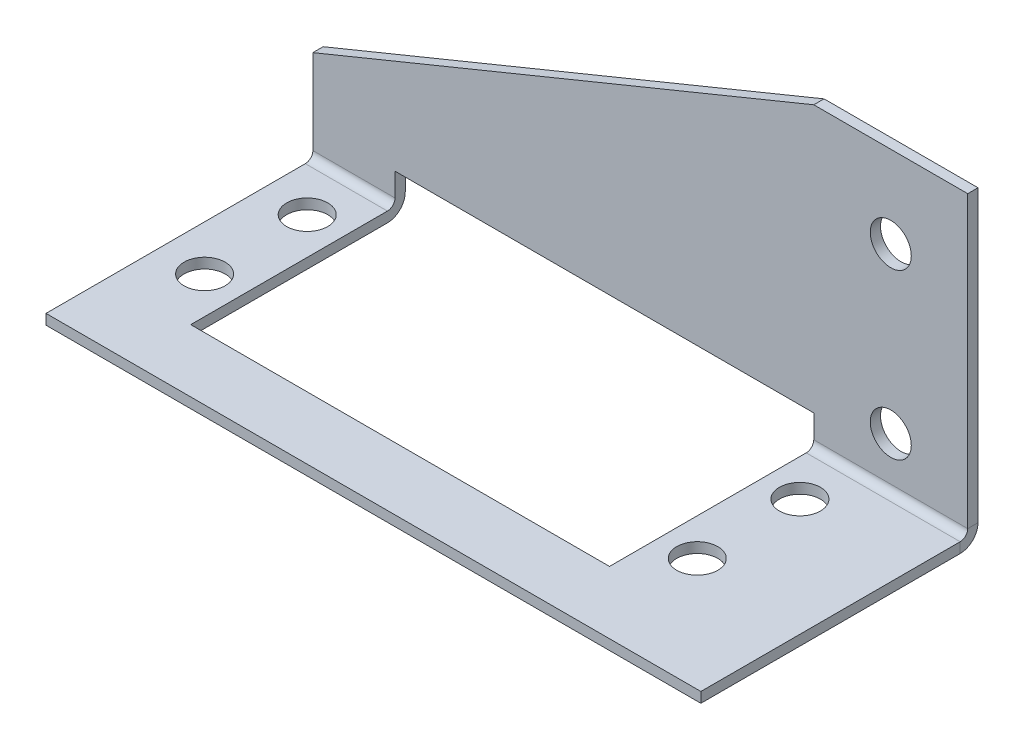
ISO-10303-21;
HEADER;
FILE_DESCRIPTION(('STEP AP214'),'2;1');
FILE_NAME('part.step','',(''),(''),'','','');
FILE_SCHEMA(('AUTOMOTIVE_DESIGN { 1 0 10303 214 1 1 1 1 }'));
ENDSEC;
DATA;
#1=APPLICATION_CONTEXT('core data for automotive mechanical design processes');
#2=APPLICATION_PROTOCOL_DEFINITION('international standard','automotive_design',2000,#1);
#3=PRODUCT_CONTEXT('',#1,'mechanical');
#4=PRODUCT('Part','Part','',(#3));
#5=PRODUCT_RELATED_PRODUCT_CATEGORY('part','',(#4));
#6=PRODUCT_DEFINITION_FORMATION('','',#4);
#7=PRODUCT_DEFINITION_CONTEXT('part definition',#1,'design');
#8=PRODUCT_DEFINITION('design','',#6,#7);
#9=PRODUCT_DEFINITION_SHAPE('','',#8);
#10=(LENGTH_UNIT() NAMED_UNIT(*) SI_UNIT(.MILLI.,.METRE.));
#11=(NAMED_UNIT(*) PLANE_ANGLE_UNIT() SI_UNIT($,.RADIAN.));
#12=(NAMED_UNIT(*) SI_UNIT($,.STERADIAN.) SOLID_ANGLE_UNIT());
#13=UNCERTAINTY_MEASURE_WITH_UNIT(LENGTH_MEASURE(1.E-05),#10,'distance_accuracy_value','');
#14=(GEOMETRIC_REPRESENTATION_CONTEXT(3) GLOBAL_UNCERTAINTY_ASSIGNED_CONTEXT((#13)) GLOBAL_UNIT_ASSIGNED_CONTEXT((#10,
#11,#12)) REPRESENTATION_CONTEXT('',''));
#15=CARTESIAN_POINT('',(0.,0.,0.));
#16=DIRECTION('',(0.,0.,1.));
#17=DIRECTION('',(1.,0.,0.));
#18=AXIS2_PLACEMENT_3D('',#15,#16,#17);
#19=CARTESIAN_POINT('',(15.,1.73659999999999,1.7366));
#20=DIRECTION('',(1.,0.,0.));
#21=DIRECTION('',(0.,-1.,0.));
#22=AXIS2_PLACEMENT_3D('',#19,#20,#21);
#23=CYLINDRICAL_SURFACE('',#22,1.7366);
#24=CARTESIAN_POINT('',(-40.8000000000012,1.73659999999999,1.7366));
#25=DIRECTION('',(-1.,0.,0.));
#26=DIRECTION('',(0.,-1.,0.));
#27=AXIS2_PLACEMENT_3D('',#24,#25,#26);
#28=CIRCLE('',#27,1.7366);
#29=CARTESIAN_POINT('',(-40.8000000000012,0.,1.7366));
#30=VERTEX_POINT('',#29);
#31=CARTESIAN_POINT('',(-40.8000000000012,1.7366,0.));
#32=VERTEX_POINT('',#31);
#33=EDGE_CURVE('E190',#30,#32,#28,.F.);
#34=ORIENTED_EDGE('',*,*,#33,.F.);
#35=DIRECTION('',(1.,0.,0.));
#36=VECTOR('',#35,1.);
#37=CARTESIAN_POINT('',(-48.8000000000012,0.,1.73659999999999));
#38=LINE('',#37,#36);
#39=CARTESIAN_POINT('',(-48.8000000000012,0.,1.7366));
#40=VERTEX_POINT('',#39);
#41=EDGE_CURVE('E251',#30,#40,#38,.F.);
#42=ORIENTED_EDGE('',*,*,#41,.T.);
#43=CARTESIAN_POINT('',(-48.8000000000012,1.73659999999999,1.7366));
#44=DIRECTION('',(1.,0.,0.));
#45=DIRECTION('',(0.,0.,-1.));
#46=AXIS2_PLACEMENT_3D('',#43,#44,#45);
#47=CIRCLE('',#46,1.7366);
#48=CARTESIAN_POINT('',(-48.8000000000012,1.7366,0.));
#49=VERTEX_POINT('',#48);
#50=EDGE_CURVE('E263',#49,#40,#47,.F.);
#51=ORIENTED_EDGE('',*,*,#50,.F.);
#52=DIRECTION('',(1.,0.,0.));
#53=VECTOR('',#52,1.);
#54=CARTESIAN_POINT('',(15.,1.7366,0.));
#55=LINE('',#54,#53);
#56=EDGE_CURVE('E264',#32,#49,#55,.F.);
#57=ORIENTED_EDGE('',*,*,#56,.F.);
#58=EDGE_LOOP('',(#34,#42,#51,#57));
#59=FACE_BOUND('',#58,.T.);
#60=ADVANCED_FACE('F54',(#59),#23,.T.);
#61=CARTESIAN_POINT('',(15.,1.73659999999999,1.7366));
#62=DIRECTION('',(1.,0.,0.));
#63=DIRECTION('',(0.,-1.,0.));
#64=AXIS2_PLACEMENT_3D('',#61,#62,#63);
#65=CYLINDRICAL_SURFACE('',#64,0.736600000000004);
#66=DIRECTION('',(1.,0.,0.));
#67=VECTOR('',#66,1.);
#68=CARTESIAN_POINT('',(-48.8000000000012,0.99999999999999,1.7366));
#69=LINE('',#68,#67);
#70=CARTESIAN_POINT('',(-48.8000000000012,0.99999999999999,1.7366));
#71=VERTEX_POINT('',#70);
#72=CARTESIAN_POINT('',(-40.8000000000012,0.999999999999991,1.7366));
#73=VERTEX_POINT('',#72);
#74=EDGE_CURVE('E255',#71,#73,#69,.T.);
#75=ORIENTED_EDGE('',*,*,#74,.T.);
#76=CARTESIAN_POINT('',(-40.8000000000012,1.73659999999999,1.7366));
#77=DIRECTION('',(-1.,0.,0.));
#78=DIRECTION('',(0.,-1.,0.));
#79=AXIS2_PLACEMENT_3D('',#76,#77,#78);
#80=CIRCLE('',#79,0.736600000000004);
#81=CARTESIAN_POINT('',(-40.8000000000012,1.7366,0.999999999999997));
#82=VERTEX_POINT('',#81);
#83=EDGE_CURVE('E219',#73,#82,#80,.F.);
#84=ORIENTED_EDGE('',*,*,#83,.T.);
#85=DIRECTION('',(1.,0.,0.));
#86=VECTOR('',#85,1.);
#87=CARTESIAN_POINT('',(15.,1.7366,0.999999999999997));
#88=LINE('',#87,#86);
#89=CARTESIAN_POINT('',(-48.8000000000012,1.7366,1.));
#90=VERTEX_POINT('',#89);
#91=EDGE_CURVE('E277',#82,#90,#88,.F.);
#92=ORIENTED_EDGE('',*,*,#91,.T.);
#93=CARTESIAN_POINT('',(-48.8000000000012,1.73659999999999,1.7366));
#94=DIRECTION('',(1.,0.,0.));
#95=DIRECTION('',(0.,0.,-1.));
#96=AXIS2_PLACEMENT_3D('',#93,#94,#95);
#97=CIRCLE('',#96,0.736600000000004);
#98=EDGE_CURVE('E271',#90,#71,#97,.F.);
#99=ORIENTED_EDGE('',*,*,#98,.T.);
#100=EDGE_LOOP('',(#75,#84,#92,#99));
#101=FACE_BOUND('',#100,.T.);
#102=ADVANCED_FACE('F368',(#101),#65,.F.);
#103=CARTESIAN_POINT('',(15.,0.,1.));
#104=DIRECTION('',(-1.,0.,0.));
#105=DIRECTION('',(0.,0.,1.));
#106=AXIS2_PLACEMENT_3D('',#103,#104,#105);
#107=PLANE('',#106);
#108=DIRECTION('',(0.,0.,-1.));
#109=VECTOR('',#108,1.);
#110=CARTESIAN_POINT('',(15.,1.7366,0.999999999999997));
#111=LINE('',#110,#109);
#112=CARTESIAN_POINT('',(15.,1.7366,1.));
#113=VERTEX_POINT('',#112);
#114=CARTESIAN_POINT('',(15.,1.7366,0.));
#115=VERTEX_POINT('',#114);
#116=EDGE_CURVE('E267',#113,#115,#111,.T.);
#117=ORIENTED_EDGE('',*,*,#116,.T.);
#118=DIRECTION('',(0.,1.,0.));
#119=VECTOR('',#118,1.);
#120=CARTESIAN_POINT('',(15.,0.,0.));
#121=LINE('',#120,#119);
#122=CARTESIAN_POINT('',(15.,30.,0.));
#123=VERTEX_POINT('',#122);
#124=EDGE_CURVE('E283',#115,#123,#121,.T.);
#125=ORIENTED_EDGE('',*,*,#124,.T.);
#126=DIRECTION('',(0.,0.,-1.));
#127=VECTOR('',#126,1.);
#128=CARTESIAN_POINT('',(15.,30.,1.));
#129=LINE('',#128,#127);
#130=CARTESIAN_POINT('',(15.,30.,1.));
#131=VERTEX_POINT('',#130);
#132=EDGE_CURVE('E308',#131,#123,#129,.T.);
#133=ORIENTED_EDGE('',*,*,#132,.F.);
#134=DIRECTION('',(0.,1.,0.));
#135=VECTOR('',#134,1.);
#136=CARTESIAN_POINT('',(15.,0.,1.));
#137=LINE('',#136,#135);
#138=EDGE_CURVE('E285',#113,#131,#137,.T.);
#139=ORIENTED_EDGE('',*,*,#138,.F.);
#140=EDGE_LOOP('',(#117,#125,#133,#139));
#141=FACE_BOUND('',#140,.T.);
#142=ADVANCED_FACE('F56',(#141),#107,.F.);
#143=CARTESIAN_POINT('',(-48.8000000000012,0.,1.));
#144=DIRECTION('',(1.,0.,0.));
#145=DIRECTION('',(0.,0.,-1.));
#146=AXIS2_PLACEMENT_3D('',#143,#144,#145);
#147=PLANE('',#146);
#148=DIRECTION('',(0.,0.,-1.));
#149=VECTOR('',#148,1.);
#150=CARTESIAN_POINT('',(-48.8000000000012,1.7366,0.999999999999997));
#151=LINE('',#150,#149);
#152=EDGE_CURVE('E280',#90,#49,#151,.T.);
#153=ORIENTED_EDGE('',*,*,#152,.F.);
#154=DIRECTION('',(0.,-1.,0.));
#155=VECTOR('',#154,1.);
#156=CARTESIAN_POINT('',(-48.8000000000012,0.,1.));
#157=LINE('',#156,#155);
#158=CARTESIAN_POINT('',(-48.8000000000012,9.99999999999999,1.));
#159=VERTEX_POINT('',#158);
#160=EDGE_CURVE('E292',#159,#90,#157,.T.);
#161=ORIENTED_EDGE('',*,*,#160,.F.);
#162=DIRECTION('',(0.,0.,-1.));
#163=VECTOR('',#162,1.);
#164=CARTESIAN_POINT('',(-48.8000000000012,9.99999999999999,1.));
#165=LINE('',#164,#163);
#166=CARTESIAN_POINT('',(-48.8000000000012,9.99999999999999,0.));
#167=VERTEX_POINT('',#166);
#168=EDGE_CURVE('E295',#159,#167,#165,.T.);
#169=ORIENTED_EDGE('',*,*,#168,.T.);
#170=DIRECTION('',(0.,-1.,0.));
#171=VECTOR('',#170,1.);
#172=CARTESIAN_POINT('',(-48.8000000000012,0.,0.));
#173=LINE('',#172,#171);
#174=EDGE_CURVE('E288',#167,#49,#173,.T.);
#175=ORIENTED_EDGE('',*,*,#174,.T.);
#176=EDGE_LOOP('',(#153,#161,#169,#175));
#177=FACE_BOUND('',#176,.T.);
#178=ADVANCED_FACE('F373',(#177),#147,.F.);
#179=CARTESIAN_POINT('',(15.,30.,1.));
#180=DIRECTION('',(0.,0.,1.));
#181=DIRECTION('',(1.,0.,0.));
#182=AXIS2_PLACEMENT_3D('',#179,#180,#181);
#183=PLANE('',#182);
#184=CARTESIAN_POINT('',(7.50000000000064,6.,1.));
#185=DIRECTION('',(0.,0.,1.));
#186=DIRECTION('',(1.,0.,0.));
#187=AXIS2_PLACEMENT_3D('',#184,#185,#186);
#188=CIRCLE('',#187,2.);
#189=CARTESIAN_POINT('',(9.50000000000064,6.,1.));
#190=VERTEX_POINT('',#189);
#191=EDGE_CURVE('E669',#190,#190,#188,.T.);
#192=ORIENTED_EDGE('',*,*,#191,.F.);
#193=EDGE_LOOP('',(#192));
#194=FACE_BOUND('',#193,.T.);
#195=CARTESIAN_POINT('',(7.50000000000064,22.,1.));
#196=DIRECTION('',(0.,0.,1.));
#197=DIRECTION('',(1.,0.,0.));
#198=AXIS2_PLACEMENT_3D('',#195,#196,#197);
#199=CIRCLE('',#198,2.);
#200=CARTESIAN_POINT('',(9.50000000000064,22.,1.));
#201=VERTEX_POINT('',#200);
#202=EDGE_CURVE('E671',#201,#201,#199,.T.);
#203=ORIENTED_EDGE('',*,*,#202,.F.);
#204=EDGE_LOOP('',(#203));
#205=FACE_BOUND('',#204,.T.);
#206=DIRECTION('',(0.,-1.,0.));
#207=VECTOR('',#206,1.);
#208=CARTESIAN_POINT('',(-40.8000000000012,30.,1.));
#209=LINE('',#208,#207);
#210=CARTESIAN_POINT('',(-40.8000000000012,3.99999999999999,1.00000000000001));
#211=VERTEX_POINT('',#210);
#212=EDGE_CURVE('E222',#211,#82,#209,.T.);
#213=ORIENTED_EDGE('',*,*,#212,.F.);
#214=DIRECTION('',(1.,0.,0.));
#215=VECTOR('',#214,1.);
#216=CARTESIAN_POINT('',(15.,4.,1.));
#217=LINE('',#216,#215);
#218=CARTESIAN_POINT('',(-1.17316292847998E-12,4.,1.));
#219=VERTEX_POINT('',#218);
#220=EDGE_CURVE('E181',#211,#219,#217,.T.);
#221=ORIENTED_EDGE('',*,*,#220,.T.);
#222=DIRECTION('',(0.,1.,0.));
#223=VECTOR('',#222,1.);
#224=CARTESIAN_POINT('',(-1.17614251671228E-12,30.,1.));
#225=LINE('',#224,#223);
#226=CARTESIAN_POINT('',(-1.17267306976032E-12,1.7366,0.999999999999997));
#227=VERTEX_POINT('',#226);
#228=EDGE_CURVE('E216',#227,#219,#225,.T.);
#229=ORIENTED_EDGE('',*,*,#228,.F.);
#230=EDGE_CURVE('E274',#113,#227,#88,.F.);
#231=ORIENTED_EDGE('',*,*,#230,.F.);
#232=ORIENTED_EDGE('',*,*,#138,.T.);
#233=DIRECTION('',(-1.,0.,0.));
#234=VECTOR('',#233,1.);
#235=CARTESIAN_POINT('',(15.,30.,1.));
#236=LINE('',#235,#234);
#237=CARTESIAN_POINT('',(0.,30.,1.));
#238=VERTEX_POINT('',#237);
#239=EDGE_CURVE('E287',#131,#238,#236,.T.);
#240=ORIENTED_EDGE('',*,*,#239,.T.);
#241=DIRECTION('',(-0.925305138660675,-0.379223417483874,0.));
#242=VECTOR('',#241,1.);
#243=CARTESIAN_POINT('',(-48.8000000000012,9.99999999999999,1.));
#244=LINE('',#243,#242);
#245=EDGE_CURVE('E290',#238,#159,#244,.T.);
#246=ORIENTED_EDGE('',*,*,#245,.T.);
#247=ORIENTED_EDGE('',*,*,#160,.T.);
#248=ORIENTED_EDGE('',*,*,#91,.F.);
#249=EDGE_LOOP('',(#213,#221,#229,#231,#232,#240,#246,#247,#248));
#250=FACE_BOUND('',#249,.T.);
#251=ADVANCED_FACE('F375',(#194,#205,#250),#183,.T.);
#252=CARTESIAN_POINT('',(15.,30.,0.));
#253=DIRECTION('',(0.,0.,1.));
#254=DIRECTION('',(1.,0.,0.));
#255=AXIS2_PLACEMENT_3D('',#252,#253,#254);
#256=PLANE('',#255);
#257=CARTESIAN_POINT('',(7.50000000000064,6.,0.));
#258=DIRECTION('',(0.,0.,1.));
#259=DIRECTION('',(1.,0.,0.));
#260=AXIS2_PLACEMENT_3D('',#257,#258,#259);
#261=CIRCLE('',#260,2.);
#262=CARTESIAN_POINT('',(9.50000000000064,6.,0.));
#263=VERTEX_POINT('',#262);
#264=EDGE_CURVE('E666',#263,#263,#261,.T.);
#265=ORIENTED_EDGE('',*,*,#264,.T.);
#266=EDGE_LOOP('',(#265));
#267=FACE_BOUND('',#266,.T.);
#268=CARTESIAN_POINT('',(7.50000000000064,22.,0.));
#269=DIRECTION('',(0.,0.,1.));
#270=DIRECTION('',(1.,0.,0.));
#271=AXIS2_PLACEMENT_3D('',#268,#269,#270);
#272=CIRCLE('',#271,2.);
#273=CARTESIAN_POINT('',(9.50000000000064,22.,0.));
#274=VERTEX_POINT('',#273);
#275=EDGE_CURVE('E674',#274,#274,#272,.T.);
#276=ORIENTED_EDGE('',*,*,#275,.T.);
#277=EDGE_LOOP('',(#276));
#278=FACE_BOUND('',#277,.T.);
#279=DIRECTION('',(1.,0.,0.));
#280=VECTOR('',#279,1.);
#281=CARTESIAN_POINT('',(-40.8000000000012,3.99999999999999,0.));
#282=LINE('',#281,#280);
#283=CARTESIAN_POINT('',(-40.8000000000012,3.99999999999999,0.));
#284=VERTEX_POINT('',#283);
#285=CARTESIAN_POINT('',(-1.17316292847998E-12,4.,0.));
#286=VERTEX_POINT('',#285);
#287=EDGE_CURVE('E178',#284,#286,#282,.T.);
#288=ORIENTED_EDGE('',*,*,#287,.F.);
#289=DIRECTION('',(0.,-1.,0.));
#290=VECTOR('',#289,1.);
#291=CARTESIAN_POINT('',(-40.8000000000012,3.99999999999999,0.));
#292=LINE('',#291,#290);
#293=EDGE_CURVE('E187',#284,#32,#292,.T.);
#294=ORIENTED_EDGE('',*,*,#293,.T.);
#295=ORIENTED_EDGE('',*,*,#56,.T.);
#296=ORIENTED_EDGE('',*,*,#174,.F.);
#297=DIRECTION('',(-0.925305138660675,-0.379223417483874,0.));
#298=VECTOR('',#297,1.);
#299=CARTESIAN_POINT('',(-48.8000000000012,9.99999999999999,0.));
#300=LINE('',#299,#298);
#301=CARTESIAN_POINT('',(0.,30.,0.));
#302=VERTEX_POINT('',#301);
#303=EDGE_CURVE('E299',#302,#167,#300,.T.);
#304=ORIENTED_EDGE('',*,*,#303,.F.);
#305=DIRECTION('',(-1.,0.,0.));
#306=VECTOR('',#305,1.);
#307=CARTESIAN_POINT('',(15.,30.,0.));
#308=LINE('',#307,#306);
#309=EDGE_CURVE('E297',#123,#302,#308,.T.);
#310=ORIENTED_EDGE('',*,*,#309,.F.);
#311=ORIENTED_EDGE('',*,*,#124,.F.);
#312=CARTESIAN_POINT('',(-1.17288574192346E-12,1.7366,0.));
#313=VERTEX_POINT('',#312);
#314=EDGE_CURVE('E261',#115,#313,#55,.F.);
#315=ORIENTED_EDGE('',*,*,#314,.T.);
#316=DIRECTION('',(0.,-1.,0.));
#317=VECTOR('',#316,1.);
#318=CARTESIAN_POINT('',(-1.17316292847998E-12,4.,0.));
#319=LINE('',#318,#317);
#320=EDGE_CURVE('E193',#286,#313,#319,.T.);
#321=ORIENTED_EDGE('',*,*,#320,.F.);
#322=EDGE_LOOP('',(#288,#294,#295,#296,#304,#310,#311,#315,#321));
#323=FACE_BOUND('',#322,.T.);
#324=ADVANCED_FACE('F196',(#267,#278,#323),#256,.F.);
#325=CARTESIAN_POINT('',(15.,30.,1.));
#326=DIRECTION('',(0.,-1.,0.));
#327=DIRECTION('',(1.,0.,0.));
#328=AXIS2_PLACEMENT_3D('',#325,#326,#327);
#329=PLANE('',#328);
#330=ORIENTED_EDGE('',*,*,#309,.T.);
#331=DIRECTION('',(0.,0.,-1.));
#332=VECTOR('',#331,1.);
#333=CARTESIAN_POINT('',(0.,30.,1.));
#334=LINE('',#333,#332);
#335=EDGE_CURVE('E305',#238,#302,#334,.T.);
#336=ORIENTED_EDGE('',*,*,#335,.F.);
#337=ORIENTED_EDGE('',*,*,#239,.F.);
#338=ORIENTED_EDGE('',*,*,#132,.T.);
#339=EDGE_LOOP('',(#330,#336,#337,#338));
#340=FACE_BOUND('',#339,.T.);
#341=ADVANCED_FACE('F388',(#340),#329,.F.);
#342=CARTESIAN_POINT('',(-48.8000000000012,9.99999999999999,1.));
#343=DIRECTION('',(0.379223417483874,-0.925305138660675,0.));
#344=DIRECTION('',(0.925305138660675,0.379223417483874,0.));
#345=AXIS2_PLACEMENT_3D('',#342,#343,#344);
#346=PLANE('',#345);
#347=ORIENTED_EDGE('',*,*,#303,.T.);
#348=ORIENTED_EDGE('',*,*,#168,.F.);
#349=ORIENTED_EDGE('',*,*,#245,.F.);
#350=ORIENTED_EDGE('',*,*,#335,.T.);
#351=EDGE_LOOP('',(#347,#348,#349,#350));
#352=FACE_BOUND('',#351,.T.);
#353=ADVANCED_FACE('F381',(#352),#346,.F.);
#354=CARTESIAN_POINT('',(-48.8000000000012,1.73659999999999,1.7366));
#355=DIRECTION('',(-1.,0.,0.));
#356=DIRECTION('',(0.,0.,1.));
#357=AXIS2_PLACEMENT_3D('',#354,#355,#356);
#358=PLANE('',#357);
#359=DIRECTION('',(0.,1.,0.));
#360=VECTOR('',#359,1.);
#361=CARTESIAN_POINT('',(-48.8000000000012,0.,1.73659999999999));
#362=LINE('',#361,#360);
#363=EDGE_CURVE('E226',#71,#40,#362,.F.);
#364=ORIENTED_EDGE('',*,*,#363,.F.);
#365=ORIENTED_EDGE('',*,*,#98,.F.);
#366=ORIENTED_EDGE('',*,*,#152,.T.);
#367=ORIENTED_EDGE('',*,*,#50,.T.);
#368=EDGE_LOOP('',(#364,#365,#366,#367));
#369=FACE_BOUND('',#368,.T.);
#370=ADVANCED_FACE('F354',(#369),#358,.T.);
#371=CARTESIAN_POINT('',(15.,1.73659999999999,1.7366));
#372=DIRECTION('',(-1.,0.,0.));
#373=DIRECTION('',(0.,0.,1.));
#374=AXIS2_PLACEMENT_3D('',#371,#372,#373);
#375=PLANE('',#374);
#376=CARTESIAN_POINT('',(15.,1.73659999999999,1.7366));
#377=DIRECTION('',(1.,0.,0.));
#378=DIRECTION('',(0.,0.,-1.));
#379=AXIS2_PLACEMENT_3D('',#376,#377,#378);
#380=CIRCLE('',#379,0.736600000000004);
#381=CARTESIAN_POINT('',(15.,0.99999999999999,1.7366));
#382=VERTEX_POINT('',#381);
#383=EDGE_CURVE('E230',#382,#113,#380,.T.);
#384=ORIENTED_EDGE('',*,*,#383,.F.);
#385=DIRECTION('',(0.,1.,0.));
#386=VECTOR('',#385,1.);
#387=CARTESIAN_POINT('',(15.,0.999999999999998,1.7366));
#388=LINE('',#387,#386);
#389=CARTESIAN_POINT('',(15.,0.,1.7366));
#390=VERTEX_POINT('',#389);
#391=EDGE_CURVE('E252',#382,#390,#388,.F.);
#392=ORIENTED_EDGE('',*,*,#391,.T.);
#393=CARTESIAN_POINT('',(15.,1.73659999999999,1.7366));
#394=DIRECTION('',(1.,0.,0.));
#395=DIRECTION('',(0.,0.,-1.));
#396=AXIS2_PLACEMENT_3D('',#393,#394,#395);
#397=CIRCLE('',#396,1.7366);
#398=EDGE_CURVE('E268',#390,#115,#397,.T.);
#399=ORIENTED_EDGE('',*,*,#398,.T.);
#400=ORIENTED_EDGE('',*,*,#116,.F.);
#401=EDGE_LOOP('',(#384,#392,#399,#400));
#402=FACE_BOUND('',#401,.T.);
#403=ADVANCED_FACE('F394',(#402),#375,.F.);
#404=CARTESIAN_POINT('',(-1.17267306976032E-12,1.73659999999999,1.7366));
#405=DIRECTION('',(1.,0.,0.));
#406=DIRECTION('',(0.,1.,0.));
#407=AXIS2_PLACEMENT_3D('',#404,#405,#406);
#408=CIRCLE('',#407,1.7366);
#409=CARTESIAN_POINT('',(-1.17267306976032E-12,0.,1.7366));
#410=VERTEX_POINT('',#409);
#411=EDGE_CURVE('E71',#313,#410,#408,.F.);
#412=ORIENTED_EDGE('',*,*,#411,.F.);
#413=ORIENTED_EDGE('',*,*,#314,.F.);
#414=ORIENTED_EDGE('',*,*,#398,.F.);
#415=EDGE_CURVE('E248',#390,#410,#38,.F.);
#416=ORIENTED_EDGE('',*,*,#415,.T.);
#417=EDGE_LOOP('',(#412,#413,#414,#416));
#418=FACE_BOUND('',#417,.T.);
#419=ADVANCED_FACE('F408',(#418),#23,.T.);
#420=ORIENTED_EDGE('',*,*,#230,.T.);
#421=CARTESIAN_POINT('',(-1.17267306976032E-12,1.73659999999999,1.7366));
#422=DIRECTION('',(1.,0.,0.));
#423=DIRECTION('',(0.,1.,0.));
#424=AXIS2_PLACEMENT_3D('',#421,#422,#423);
#425=CIRCLE('',#424,0.736600000000004);
#426=CARTESIAN_POINT('',(-1.17267306976032E-12,0.999999999999996,1.7366));
#427=VERTEX_POINT('',#426);
#428=EDGE_CURVE('E211',#227,#427,#425,.F.);
#429=ORIENTED_EDGE('',*,*,#428,.T.);
#430=EDGE_CURVE('E258',#427,#382,#69,.T.);
#431=ORIENTED_EDGE('',*,*,#430,.T.);
#432=ORIENTED_EDGE('',*,*,#383,.T.);
#433=EDGE_LOOP('',(#420,#429,#431,#432));
#434=FACE_BOUND('',#433,.T.);
#435=ADVANCED_FACE('F397',(#434),#65,.F.);
#436=CARTESIAN_POINT('',(-48.8000000000012,0.,0.999999999999997));
#437=DIRECTION('',(1.,0.,0.));
#438=DIRECTION('',(0.,1.,0.));
#439=AXIS2_PLACEMENT_3D('',#436,#437,#438);
#440=PLANE('',#439);
#441=ORIENTED_EDGE('',*,*,#363,.T.);
#442=DIRECTION('',(0.,0.,-1.));
#443=VECTOR('',#442,1.);
#444=CARTESIAN_POINT('',(-48.8000000000012,0.,27.));
#445=LINE('',#444,#443);
#446=CARTESIAN_POINT('',(-48.8000000000012,0.,27.));
#447=VERTEX_POINT('',#446);
#448=EDGE_CURVE('E238',#447,#40,#445,.T.);
#449=ORIENTED_EDGE('',*,*,#448,.F.);
#450=DIRECTION('',(0.,1.,0.));
#451=VECTOR('',#450,1.);
#452=CARTESIAN_POINT('',(-48.8000000000012,0.,27.));
#453=LINE('',#452,#451);
#454=CARTESIAN_POINT('',(-48.8000000000012,0.999999999999901,27.));
#455=VERTEX_POINT('',#454);
#456=EDGE_CURVE('E231',#447,#455,#453,.T.);
#457=ORIENTED_EDGE('',*,*,#456,.T.);
#458=DIRECTION('',(0.,0.,1.));
#459=VECTOR('',#458,1.);
#460=CARTESIAN_POINT('',(-48.8000000000012,0.999999999999992,1.));
#461=LINE('',#460,#459);
#462=EDGE_CURVE('E245',#455,#71,#461,.F.);
#463=ORIENTED_EDGE('',*,*,#462,.T.);
#464=EDGE_LOOP('',(#441,#449,#457,#463));
#465=FACE_BOUND('',#464,.T.);
#466=ADVANCED_FACE('F358',(#465),#440,.F.);
#467=CARTESIAN_POINT('',(15.,0.,27.));
#468=DIRECTION('',(-1.,0.,0.));
#469=DIRECTION('',(0.,-1.,0.));
#470=AXIS2_PLACEMENT_3D('',#467,#468,#469);
#471=PLANE('',#470);
#472=ORIENTED_EDGE('',*,*,#391,.F.);
#473=DIRECTION('',(0.,0.,-1.));
#474=VECTOR('',#473,1.);
#475=CARTESIAN_POINT('',(15.,0.999999999999909,27.));
#476=LINE('',#475,#474);
#477=CARTESIAN_POINT('',(15.,0.999999999999909,27.));
#478=VERTEX_POINT('',#477);
#479=EDGE_CURVE('E243',#382,#478,#476,.F.);
#480=ORIENTED_EDGE('',*,*,#479,.T.);
#481=DIRECTION('',(0.,1.,0.));
#482=VECTOR('',#481,1.);
#483=CARTESIAN_POINT('',(15.,0.,27.));
#484=LINE('',#483,#482);
#485=CARTESIAN_POINT('',(15.,0.,27.));
#486=VERTEX_POINT('',#485);
#487=EDGE_CURVE('E227',#486,#478,#484,.T.);
#488=ORIENTED_EDGE('',*,*,#487,.F.);
#489=DIRECTION('',(0.,0.,1.));
#490=VECTOR('',#489,1.);
#491=CARTESIAN_POINT('',(15.,0.,27.));
#492=LINE('',#491,#490);
#493=EDGE_CURVE('E236',#390,#486,#492,.T.);
#494=ORIENTED_EDGE('',*,*,#493,.F.);
#495=EDGE_LOOP('',(#472,#480,#488,#494));
#496=FACE_BOUND('',#495,.T.);
#497=ADVANCED_FACE('F344',(#496),#471,.F.);
#498=CARTESIAN_POINT('',(-48.8000000000012,0.,27.));
#499=DIRECTION('',(0.,1.,0.));
#500=DIRECTION('',(0.,0.,1.));
#501=AXIS2_PLACEMENT_3D('',#498,#499,#500);
#502=PLANE('',#501);
#503=CARTESIAN_POINT('',(-44.4000000000012,0.,5.94999999999902));
#504=DIRECTION('',(0.,-1.,0.));
#505=DIRECTION('',(0.,0.,-1.));
#506=AXIS2_PLACEMENT_3D('',#503,#504,#505);
#507=CIRCLE('',#506,2.);
#508=CARTESIAN_POINT('',(-44.4000000000012,0.,3.94999999999901));
#509=VERTEX_POINT('',#508);
#510=EDGE_CURVE('E332',#509,#509,#507,.T.);
#511=ORIENTED_EDGE('',*,*,#510,.F.);
#512=EDGE_LOOP('',(#511));
#513=FACE_BOUND('',#512,.T.);
#514=CARTESIAN_POINT('',(-44.4000000000012,0.,15.949999999999));
#515=DIRECTION('',(0.,-1.,0.));
#516=DIRECTION('',(0.,0.,-1.));
#517=AXIS2_PLACEMENT_3D('',#514,#515,#516);
#518=CIRCLE('',#517,2.);
#519=CARTESIAN_POINT('',(-44.4000000000012,0.,13.949999999999));
#520=VERTEX_POINT('',#519);
#521=EDGE_CURVE('E322',#520,#520,#518,.T.);
#522=ORIENTED_EDGE('',*,*,#521,.F.);
#523=EDGE_LOOP('',(#522));
#524=FACE_BOUND('',#523,.T.);
#525=CARTESIAN_POINT('',(3.59999999999883,0.,5.94999999999902));
#526=DIRECTION('',(0.,-1.,0.));
#527=DIRECTION('',(0.,0.,-1.));
#528=AXIS2_PLACEMENT_3D('',#525,#526,#527);
#529=CIRCLE('',#528,2.);
#530=CARTESIAN_POINT('',(3.59999999999883,0.,3.94999999999902));
#531=VERTEX_POINT('',#530);
#532=EDGE_CURVE('E319',#531,#531,#529,.T.);
#533=ORIENTED_EDGE('',*,*,#532,.F.);
#534=EDGE_LOOP('',(#533));
#535=FACE_BOUND('',#534,.T.);
#536=CARTESIAN_POINT('',(3.59999999999883,0.,15.949999999999));
#537=DIRECTION('',(0.,-1.,0.));
#538=DIRECTION('',(0.,0.,-1.));
#539=AXIS2_PLACEMENT_3D('',#536,#537,#538);
#540=CIRCLE('',#539,2.);
#541=CARTESIAN_POINT('',(3.59999999999883,0.,13.949999999999));
#542=VERTEX_POINT('',#541);
#543=EDGE_CURVE('E316',#542,#542,#540,.T.);
#544=ORIENTED_EDGE('',*,*,#543,.F.);
#545=EDGE_LOOP('',(#544));
#546=FACE_BOUND('',#545,.T.);
#547=ORIENTED_EDGE('',*,*,#41,.F.);
#548=DIRECTION('',(0.,0.,-1.));
#549=VECTOR('',#548,1.);
#550=CARTESIAN_POINT('',(-40.8000000000012,0.,20.899999999999));
#551=LINE('',#550,#549);
#552=CARTESIAN_POINT('',(-40.8000000000012,0.,20.899999999999));
#553=VERTEX_POINT('',#552);
#554=EDGE_CURVE('E202',#553,#30,#551,.T.);
#555=ORIENTED_EDGE('',*,*,#554,.F.);
#556=DIRECTION('',(-1.,0.,0.));
#557=VECTOR('',#556,1.);
#558=CARTESIAN_POINT('',(-40.8000000000012,0.,20.899999999999));
#559=LINE('',#558,#557);
#560=CARTESIAN_POINT('',(-1.17267306976032E-12,0.,20.899999999999));
#561=VERTEX_POINT('',#560);
#562=EDGE_CURVE('E184',#561,#553,#559,.T.);
#563=ORIENTED_EDGE('',*,*,#562,.F.);
#564=DIRECTION('',(0.,0.,1.));
#565=VECTOR('',#564,1.);
#566=CARTESIAN_POINT('',(-1.17267306976032E-12,0.,20.899999999999));
#567=LINE('',#566,#565);
#568=EDGE_CURVE('E204',#410,#561,#567,.T.);
#569=ORIENTED_EDGE('',*,*,#568,.F.);
#570=ORIENTED_EDGE('',*,*,#415,.F.);
#571=ORIENTED_EDGE('',*,*,#493,.T.);
#572=DIRECTION('',(-1.,0.,0.));
#573=VECTOR('',#572,1.);
#574=CARTESIAN_POINT('',(-48.8000000000012,0.,27.));
#575=LINE('',#574,#573);
#576=EDGE_CURVE('E234',#486,#447,#575,.T.);
#577=ORIENTED_EDGE('',*,*,#576,.T.);
#578=ORIENTED_EDGE('',*,*,#448,.T.);
#579=EDGE_LOOP('',(#547,#555,#563,#569,#570,#571,#577,#578));
#580=FACE_BOUND('',#579,.T.);
#581=ADVANCED_FACE('F340',(#513,#524,#535,#546,#580),#502,.F.);
#582=CARTESIAN_POINT('',(-48.8000000000012,0.999999999999901,27.));
#583=DIRECTION('',(0.,1.,0.));
#584=DIRECTION('',(0.,0.,1.));
#585=AXIS2_PLACEMENT_3D('',#582,#583,#584);
#586=PLANE('',#585);
#587=CARTESIAN_POINT('',(-44.4000000000012,0.999999999999975,5.94999999999902));
#588=DIRECTION('',(0.,1.,0.));
#589=DIRECTION('',(0.,0.,1.));
#590=AXIS2_PLACEMENT_3D('',#587,#588,#589);
#591=CIRCLE('',#590,2.);
#592=CARTESIAN_POINT('',(-44.4000000000012,0.999999999999968,7.94999999999902));
#593=VERTEX_POINT('',#592);
#594=EDGE_CURVE('E58',#593,#593,#591,.T.);
#595=ORIENTED_EDGE('',*,*,#594,.F.);
#596=EDGE_LOOP('',(#595));
#597=FACE_BOUND('',#596,.T.);
#598=CARTESIAN_POINT('',(-44.4000000000012,0.99999999999994,15.949999999999));
#599=DIRECTION('',(0.,1.,0.));
#600=DIRECTION('',(0.,0.,1.));
#601=AXIS2_PLACEMENT_3D('',#598,#599,#600);
#602=CIRCLE('',#601,2.);
#603=CARTESIAN_POINT('',(-44.4000000000012,0.999999999999933,17.949999999999));
#604=VERTEX_POINT('',#603);
#605=EDGE_CURVE('E320',#604,#604,#602,.T.);
#606=ORIENTED_EDGE('',*,*,#605,.F.);
#607=EDGE_LOOP('',(#606));
#608=FACE_BOUND('',#607,.T.);
#609=CARTESIAN_POINT('',(3.59999999999883,0.999999999999981,5.94999999999902));
#610=DIRECTION('',(0.,1.,0.));
#611=DIRECTION('',(0.,0.,1.));
#612=AXIS2_PLACEMENT_3D('',#609,#610,#611);
#613=CIRCLE('',#612,2.);
#614=CARTESIAN_POINT('',(3.59999999999883,0.999999999999974,7.94999999999902));
#615=VERTEX_POINT('',#614);
#616=EDGE_CURVE('E317',#615,#615,#613,.T.);
#617=ORIENTED_EDGE('',*,*,#616,.F.);
#618=EDGE_LOOP('',(#617));
#619=FACE_BOUND('',#618,.T.);
#620=CARTESIAN_POINT('',(3.59999999999883,0.999999999999946,15.9499999999991));
#621=DIRECTION('',(0.,1.,0.));
#622=DIRECTION('',(0.,0.,1.));
#623=AXIS2_PLACEMENT_3D('',#620,#621,#622);
#624=CIRCLE('',#623,2.);
#625=CARTESIAN_POINT('',(3.59999999999883,0.999999999999939,17.9499999999991));
#626=VERTEX_POINT('',#625);
#627=EDGE_CURVE('E205',#626,#626,#624,.T.);
#628=ORIENTED_EDGE('',*,*,#627,.F.);
#629=EDGE_LOOP('',(#628));
#630=FACE_BOUND('',#629,.T.);
#631=DIRECTION('',(0.,0.,1.));
#632=VECTOR('',#631,1.);
#633=CARTESIAN_POINT('',(-40.8000000000012,0.999999999999902,27.));
#634=LINE('',#633,#632);
#635=CARTESIAN_POINT('',(-40.8000000000012,0.999999999999926,20.899999999999));
#636=VERTEX_POINT('',#635);
#637=EDGE_CURVE('E13',#73,#636,#634,.T.);
#638=ORIENTED_EDGE('',*,*,#637,.F.);
#639=ORIENTED_EDGE('',*,*,#74,.F.);
#640=ORIENTED_EDGE('',*,*,#462,.F.);
#641=DIRECTION('',(1.,0.,0.));
#642=VECTOR('',#641,1.);
#643=CARTESIAN_POINT('',(-48.8000000000012,0.999999999999901,27.));
#644=LINE('',#643,#642);
#645=EDGE_CURVE('E241',#478,#455,#644,.F.);
#646=ORIENTED_EDGE('',*,*,#645,.F.);
#647=ORIENTED_EDGE('',*,*,#479,.F.);
#648=ORIENTED_EDGE('',*,*,#430,.F.);
#649=DIRECTION('',(0.,0.,-1.));
#650=VECTOR('',#649,1.);
#651=CARTESIAN_POINT('',(-1.17267306976032E-12,0.999999999999907,27.));
#652=LINE('',#651,#650);
#653=CARTESIAN_POINT('',(-1.17267306976032E-12,0.999999999999929,20.8999999999991));
#654=VERTEX_POINT('',#653);
#655=EDGE_CURVE('E311',#654,#427,#652,.T.);
#656=ORIENTED_EDGE('',*,*,#655,.F.);
#657=DIRECTION('',(1.,0.,0.));
#658=VECTOR('',#657,1.);
#659=CARTESIAN_POINT('',(-48.8000000000012,0.999999999999923,20.899999999999));
#660=LINE('',#659,#658);
#661=EDGE_CURVE('E63',#636,#654,#660,.T.);
#662=ORIENTED_EDGE('',*,*,#661,.F.);
#663=EDGE_LOOP('',(#638,#639,#640,#646,#647,#648,#656,#662));
#664=FACE_BOUND('',#663,.T.);
#665=ADVANCED_FACE('F343',(#597,#608,#619,#630,#664),#586,.T.);
#666=CARTESIAN_POINT('',(-48.8000000000012,0.,27.));
#667=DIRECTION('',(0.,0.,-1.));
#668=DIRECTION('',(0.,1.,0.));
#669=AXIS2_PLACEMENT_3D('',#666,#667,#668);
#670=PLANE('',#669);
#671=ORIENTED_EDGE('',*,*,#645,.T.);
#672=ORIENTED_EDGE('',*,*,#456,.F.);
#673=ORIENTED_EDGE('',*,*,#576,.F.);
#674=ORIENTED_EDGE('',*,*,#487,.T.);
#675=EDGE_LOOP('',(#671,#672,#673,#674));
#676=FACE_BOUND('',#675,.T.);
#677=ADVANCED_FACE('F405',(#676),#670,.F.);
#678=CARTESIAN_POINT('',(-40.8000000000012,3.99999999999992,20.8999999999991));
#679=DIRECTION('',(-1.,0.,0.));
#680=DIRECTION('',(0.,-1.,0.));
#681=AXIS2_PLACEMENT_3D('',#678,#679,#680);
#682=PLANE('',#681);
#683=ORIENTED_EDGE('',*,*,#33,.T.);
#684=ORIENTED_EDGE('',*,*,#293,.F.);
#685=DIRECTION('',(0.,0.,-1.));
#686=VECTOR('',#685,1.);
#687=CARTESIAN_POINT('',(-40.8000000000012,3.99999999999992,20.8999999999991));
#688=LINE('',#687,#686);
#689=EDGE_CURVE('E173',#211,#284,#688,.T.);
#690=ORIENTED_EDGE('',*,*,#689,.F.);
#691=ORIENTED_EDGE('',*,*,#212,.T.);
#692=ORIENTED_EDGE('',*,*,#83,.F.);
#693=ORIENTED_EDGE('',*,*,#637,.T.);
#694=DIRECTION('',(0.,-1.,0.));
#695=VECTOR('',#694,1.);
#696=CARTESIAN_POINT('',(-40.8000000000012,3.99999999999992,20.8999999999991));
#697=LINE('',#696,#695);
#698=EDGE_CURVE('E209',#636,#553,#697,.T.);
#699=ORIENTED_EDGE('',*,*,#698,.T.);
#700=ORIENTED_EDGE('',*,*,#554,.T.);
#701=EDGE_LOOP('',(#683,#684,#690,#691,#692,#693,#699,#700));
#702=FACE_BOUND('',#701,.T.);
#703=ADVANCED_FACE('F188',(#702),#682,.F.);
#704=CARTESIAN_POINT('',(-40.8000000000012,3.99999999999992,20.8999999999991));
#705=DIRECTION('',(0.,0.,1.));
#706=DIRECTION('',(0.,-1.,0.));
#707=AXIS2_PLACEMENT_3D('',#704,#705,#706);
#708=PLANE('',#707);
#709=ORIENTED_EDGE('',*,*,#661,.T.);
#710=DIRECTION('',(0.,-1.,0.));
#711=VECTOR('',#710,1.);
#712=CARTESIAN_POINT('',(-1.17316292847998E-12,3.99999999999993,20.8999999999991));
#713=LINE('',#712,#711);
#714=EDGE_CURVE('E77',#654,#561,#713,.T.);
#715=ORIENTED_EDGE('',*,*,#714,.T.);
#716=ORIENTED_EDGE('',*,*,#562,.T.);
#717=ORIENTED_EDGE('',*,*,#698,.F.);
#718=EDGE_LOOP('',(#709,#715,#716,#717));
#719=FACE_BOUND('',#718,.T.);
#720=ADVANCED_FACE('F548',(#719),#708,.F.);
#721=CARTESIAN_POINT('',(-1.17316292847998E-12,3.99999999999993,20.8999999999991));
#722=DIRECTION('',(1.,0.,0.));
#723=DIRECTION('',(0.,1.,0.));
#724=AXIS2_PLACEMENT_3D('',#721,#722,#723);
#725=PLANE('',#724);
#726=ORIENTED_EDGE('',*,*,#411,.T.);
#727=ORIENTED_EDGE('',*,*,#568,.T.);
#728=ORIENTED_EDGE('',*,*,#714,.F.);
#729=ORIENTED_EDGE('',*,*,#655,.T.);
#730=ORIENTED_EDGE('',*,*,#428,.F.);
#731=ORIENTED_EDGE('',*,*,#228,.T.);
#732=DIRECTION('',(0.,0.,1.));
#733=VECTOR('',#732,1.);
#734=CARTESIAN_POINT('',(-1.17316292847998E-12,3.99999999999993,20.8999999999991));
#735=LINE('',#734,#733);
#736=EDGE_CURVE('E194',#286,#219,#735,.T.);
#737=ORIENTED_EDGE('',*,*,#736,.F.);
#738=ORIENTED_EDGE('',*,*,#320,.T.);
#739=EDGE_LOOP('',(#726,#727,#728,#729,#730,#731,#737,#738));
#740=FACE_BOUND('',#739,.T.);
#741=ADVANCED_FACE('F557',(#740),#725,.F.);
#742=CARTESIAN_POINT('',(-40.8000000000012,3.99999999999999,0.));
#743=DIRECTION('',(0.,-1.,0.));
#744=DIRECTION('',(0.,0.,-1.));
#745=AXIS2_PLACEMENT_3D('',#742,#743,#744);
#746=PLANE('',#745);
#747=ORIENTED_EDGE('',*,*,#689,.T.);
#748=ORIENTED_EDGE('',*,*,#287,.T.);
#749=ORIENTED_EDGE('',*,*,#736,.T.);
#750=ORIENTED_EDGE('',*,*,#220,.F.);
#751=EDGE_LOOP('',(#747,#748,#749,#750));
#752=FACE_BOUND('',#751,.T.);
#753=ADVANCED_FACE('F175',(#752),#746,.T.);
#754=CARTESIAN_POINT('',(3.59999999999883,3.99999999999994,15.9499999999991));
#755=DIRECTION('',(0.,-1.,0.));
#756=DIRECTION('',(0.,0.,-1.));
#757=AXIS2_PLACEMENT_3D('',#754,#755,#756);
#758=CYLINDRICAL_SURFACE('',#757,2.);
#759=ORIENTED_EDGE('',*,*,#627,.T.);
#760=EDGE_LOOP('',(#759));
#761=FACE_BOUND('',#760,.T.);
#762=ORIENTED_EDGE('',*,*,#543,.T.);
#763=EDGE_LOOP('',(#762));
#764=FACE_BOUND('',#763,.T.);
#765=ADVANCED_FACE('F338',(#761,#764),#758,.F.);
#766=CARTESIAN_POINT('',(3.59999999999883,3.99999999999998,5.94999999999903));
#767=DIRECTION('',(0.,-1.,0.));
#768=DIRECTION('',(0.,0.,-1.));
#769=AXIS2_PLACEMENT_3D('',#766,#767,#768);
#770=CYLINDRICAL_SURFACE('',#769,2.);
#771=ORIENTED_EDGE('',*,*,#616,.T.);
#772=EDGE_LOOP('',(#771));
#773=FACE_BOUND('',#772,.T.);
#774=ORIENTED_EDGE('',*,*,#532,.T.);
#775=EDGE_LOOP('',(#774));
#776=FACE_BOUND('',#775,.T.);
#777=ADVANCED_FACE('F586',(#773,#776),#770,.F.);
#778=CARTESIAN_POINT('',(-44.4000000000012,3.99999999999994,15.949999999999));
#779=DIRECTION('',(0.,-1.,0.));
#780=DIRECTION('',(0.,0.,-1.));
#781=AXIS2_PLACEMENT_3D('',#778,#779,#780);
#782=CYLINDRICAL_SURFACE('',#781,2.);
#783=ORIENTED_EDGE('',*,*,#605,.T.);
#784=EDGE_LOOP('',(#783));
#785=FACE_BOUND('',#784,.T.);
#786=ORIENTED_EDGE('',*,*,#521,.T.);
#787=EDGE_LOOP('',(#786));
#788=FACE_BOUND('',#787,.T.);
#789=ADVANCED_FACE('F597',(#785,#788),#782,.F.);
#790=CARTESIAN_POINT('',(-44.4000000000012,3.99999999999997,5.94999999999903));
#791=DIRECTION('',(0.,-1.,0.));
#792=DIRECTION('',(0.,0.,-1.));
#793=AXIS2_PLACEMENT_3D('',#790,#791,#792);
#794=CYLINDRICAL_SURFACE('',#793,2.);
#795=ORIENTED_EDGE('',*,*,#594,.T.);
#796=EDGE_LOOP('',(#795));
#797=FACE_BOUND('',#796,.T.);
#798=ORIENTED_EDGE('',*,*,#510,.T.);
#799=EDGE_LOOP('',(#798));
#800=FACE_BOUND('',#799,.T.);
#801=ADVANCED_FACE('F608',(#797,#800),#794,.F.);
#802=CARTESIAN_POINT('',(7.50000000000064,22.,0.));
#803=DIRECTION('',(0.,0.,1.));
#804=DIRECTION('',(1.,0.,0.));
#805=AXIS2_PLACEMENT_3D('',#802,#803,#804);
#806=CYLINDRICAL_SURFACE('',#805,2.);
#807=ORIENTED_EDGE('',*,*,#275,.F.);
#808=EDGE_LOOP('',(#807));
#809=FACE_BOUND('',#808,.T.);
#810=ORIENTED_EDGE('',*,*,#202,.T.);
#811=EDGE_LOOP('',(#810));
#812=FACE_BOUND('',#811,.T.);
#813=ADVANCED_FACE('F618',(#809,#812),#806,.F.);
#814=CARTESIAN_POINT('',(7.50000000000064,6.,0.));
#815=DIRECTION('',(0.,0.,1.));
#816=DIRECTION('',(1.,0.,0.));
#817=AXIS2_PLACEMENT_3D('',#814,#815,#816);
#818=CYLINDRICAL_SURFACE('',#817,2.);
#819=ORIENTED_EDGE('',*,*,#264,.F.);
#820=EDGE_LOOP('',(#819));
#821=FACE_BOUND('',#820,.T.);
#822=ORIENTED_EDGE('',*,*,#191,.T.);
#823=EDGE_LOOP('',(#822));
#824=FACE_BOUND('',#823,.T.);
#825=ADVANCED_FACE('F637',(#821,#824),#818,.F.);
#826=CLOSED_SHELL('',(#60,#102,#142,#178,#251,#324,#341,#353,#370,#403,#419,#435,#466,#497,#581,
#665,#677,#703,#720,#741,#753,#765,#777,#789,#801,#813,#825));
#827=MANIFOLD_SOLID_BREP('B2',#826);
#828=ADVANCED_BREP_SHAPE_REPRESENTATION('',(#18,#827),#14);
#829=SHAPE_DEFINITION_REPRESENTATION(#9,#828);
ENDSEC;
END-ISO-10303-21;
